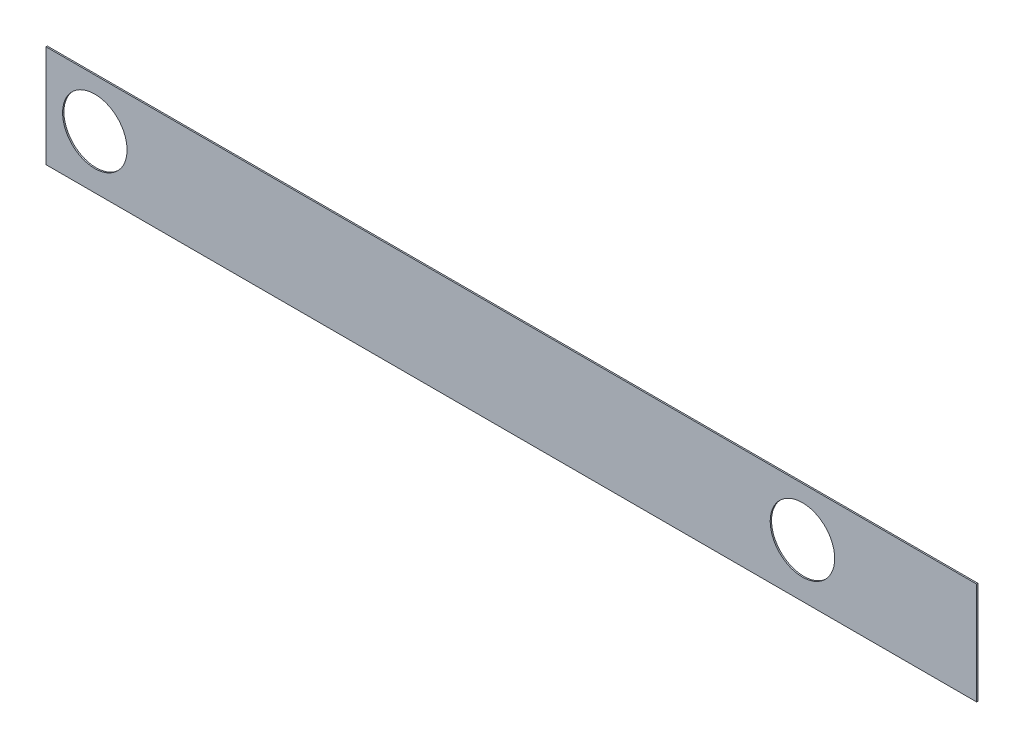
ISO-10303-21;
HEADER;
FILE_DESCRIPTION(('STEP AP214'),'2;1');
FILE_NAME('part.step','',(''),(''),'','','');
FILE_SCHEMA(('AUTOMOTIVE_DESIGN { 1 0 10303 214 1 1 1 1 }'));
ENDSEC;
DATA;
#1=APPLICATION_CONTEXT('core data for automotive mechanical design processes');
#2=APPLICATION_PROTOCOL_DEFINITION('international standard','automotive_design',2000,#1);
#3=PRODUCT_CONTEXT('',#1,'mechanical');
#4=PRODUCT('Part','Part','',(#3));
#5=PRODUCT_RELATED_PRODUCT_CATEGORY('part','',(#4));
#6=PRODUCT_DEFINITION_FORMATION('','',#4);
#7=PRODUCT_DEFINITION_CONTEXT('part definition',#1,'design');
#8=PRODUCT_DEFINITION('design','',#6,#7);
#9=PRODUCT_DEFINITION_SHAPE('','',#8);
#10=(LENGTH_UNIT() NAMED_UNIT(*) SI_UNIT(.MILLI.,.METRE.));
#11=(NAMED_UNIT(*) PLANE_ANGLE_UNIT() SI_UNIT($,.RADIAN.));
#12=(NAMED_UNIT(*) SI_UNIT($,.STERADIAN.) SOLID_ANGLE_UNIT());
#13=UNCERTAINTY_MEASURE_WITH_UNIT(LENGTH_MEASURE(1.E-05),#10,'distance_accuracy_value','');
#14=(GEOMETRIC_REPRESENTATION_CONTEXT(3) GLOBAL_UNCERTAINTY_ASSIGNED_CONTEXT((#13)) GLOBAL_UNIT_ASSIGNED_CONTEXT((#10,
#11,#12)) REPRESENTATION_CONTEXT('',''));
#15=CARTESIAN_POINT('',(0.,0.,0.));
#16=DIRECTION('',(0.,0.,1.));
#17=DIRECTION('',(1.,0.,0.));
#18=AXIS2_PLACEMENT_3D('',#15,#16,#17);
#19=CARTESIAN_POINT('',(-51.95,5.7,0.));
#20=DIRECTION('',(0.,-1.,0.));
#21=DIRECTION('',(0.,0.,-1.));
#22=AXIS2_PLACEMENT_3D('',#19,#20,#21);
#23=PLANE('',#22);
#24=DIRECTION('',(0.,0.,1.));
#25=VECTOR('',#24,1.);
#26=CARTESIAN_POINT('',(-51.95,5.7,0.));
#27=LINE('',#26,#25);
#28=CARTESIAN_POINT('',(-51.95,5.7,0.));
#29=VERTEX_POINT('',#28);
#30=CARTESIAN_POINT('',(-51.95,5.7,0.15));
#31=VERTEX_POINT('',#30);
#32=EDGE_CURVE('E11',#29,#31,#27,.T.);
#33=ORIENTED_EDGE('',*,*,#32,.T.);
#34=DIRECTION('',(1.,0.,0.));
#35=VECTOR('',#34,1.);
#36=CARTESIAN_POINT('',(-51.95,5.7,0.15));
#37=LINE('',#36,#35);
#38=CARTESIAN_POINT('',(51.95,5.7,0.15));
#39=VERTEX_POINT('',#38);
#40=EDGE_CURVE('E115',#31,#39,#37,.T.);
#41=ORIENTED_EDGE('',*,*,#40,.T.);
#42=DIRECTION('',(0.,0.,1.));
#43=VECTOR('',#42,1.);
#44=CARTESIAN_POINT('',(51.95,5.7,0.));
#45=LINE('',#44,#43);
#46=CARTESIAN_POINT('',(51.95,5.7,0.));
#47=VERTEX_POINT('',#46);
#48=EDGE_CURVE('E128',#47,#39,#45,.T.);
#49=ORIENTED_EDGE('',*,*,#48,.F.);
#50=DIRECTION('',(1.,0.,0.));
#51=VECTOR('',#50,1.);
#52=CARTESIAN_POINT('',(-51.95,5.7,0.));
#53=LINE('',#52,#51);
#54=EDGE_CURVE('E155',#29,#47,#53,.T.);
#55=ORIENTED_EDGE('',*,*,#54,.F.);
#56=EDGE_LOOP('',(#33,#41,#49,#55));
#57=FACE_BOUND('',#56,.T.);
#58=ADVANCED_FACE('F17',(#57),#23,.F.);
#59=CARTESIAN_POINT('',(-51.95,-5.7,0.));
#60=DIRECTION('',(1.,0.,0.));
#61=DIRECTION('',(0.,1.,0.));
#62=AXIS2_PLACEMENT_3D('',#59,#60,#61);
#63=PLANE('',#62);
#64=DIRECTION('',(0.,0.,1.));
#65=VECTOR('',#64,1.);
#66=CARTESIAN_POINT('',(-51.95,-5.7,0.));
#67=LINE('',#66,#65);
#68=CARTESIAN_POINT('',(-51.95,-5.7,0.));
#69=VERTEX_POINT('',#68);
#70=CARTESIAN_POINT('',(-51.95,-5.7,0.15));
#71=VERTEX_POINT('',#70);
#72=EDGE_CURVE('E27',#69,#71,#67,.T.);
#73=ORIENTED_EDGE('',*,*,#72,.T.);
#74=DIRECTION('',(0.,1.,0.));
#75=VECTOR('',#74,1.);
#76=CARTESIAN_POINT('',(-51.95,-5.7,0.15));
#77=LINE('',#76,#75);
#78=EDGE_CURVE('E98',#71,#31,#77,.T.);
#79=ORIENTED_EDGE('',*,*,#78,.T.);
#80=ORIENTED_EDGE('',*,*,#32,.F.);
#81=DIRECTION('',(0.,1.,0.));
#82=VECTOR('',#81,1.);
#83=CARTESIAN_POINT('',(-51.95,-5.7,0.));
#84=LINE('',#83,#82);
#85=EDGE_CURVE('E102',#69,#29,#84,.T.);
#86=ORIENTED_EDGE('',*,*,#85,.F.);
#87=EDGE_LOOP('',(#73,#79,#80,#86));
#88=FACE_BOUND('',#87,.T.);
#89=ADVANCED_FACE('F19',(#88),#63,.F.);
#90=CARTESIAN_POINT('',(51.95,-5.7,0.));
#91=DIRECTION('',(0.,1.,0.));
#92=DIRECTION('',(1.,0.,0.));
#93=AXIS2_PLACEMENT_3D('',#90,#91,#92);
#94=PLANE('',#93);
#95=DIRECTION('',(0.,0.,1.));
#96=VECTOR('',#95,1.);
#97=CARTESIAN_POINT('',(51.95,-5.7,0.));
#98=LINE('',#97,#96);
#99=CARTESIAN_POINT('',(51.95,-5.7,0.));
#100=VERTEX_POINT('',#99);
#101=CARTESIAN_POINT('',(51.95,-5.7,0.15));
#102=VERTEX_POINT('',#101);
#103=EDGE_CURVE('E87',#100,#102,#98,.T.);
#104=ORIENTED_EDGE('',*,*,#103,.T.);
#105=DIRECTION('',(-1.,0.,0.));
#106=VECTOR('',#105,1.);
#107=CARTESIAN_POINT('',(51.95,-5.7,0.15));
#108=LINE('',#107,#106);
#109=EDGE_CURVE('E106',#102,#71,#108,.T.);
#110=ORIENTED_EDGE('',*,*,#109,.T.);
#111=ORIENTED_EDGE('',*,*,#72,.F.);
#112=DIRECTION('',(-1.,0.,0.));
#113=VECTOR('',#112,1.);
#114=CARTESIAN_POINT('',(51.95,-5.7,0.));
#115=LINE('',#114,#113);
#116=EDGE_CURVE('E450',#100,#69,#115,.T.);
#117=ORIENTED_EDGE('',*,*,#116,.F.);
#118=EDGE_LOOP('',(#104,#110,#111,#117));
#119=FACE_BOUND('',#118,.T.);
#120=ADVANCED_FACE('F107',(#119),#94,.F.);
#121=CARTESIAN_POINT('',(51.95,5.7,0.));
#122=DIRECTION('',(-1.,0.,0.));
#123=DIRECTION('',(0.,0.,1.));
#124=AXIS2_PLACEMENT_3D('',#121,#122,#123);
#125=PLANE('',#124);
#126=ORIENTED_EDGE('',*,*,#48,.T.);
#127=DIRECTION('',(0.,-1.,0.));
#128=VECTOR('',#127,1.);
#129=CARTESIAN_POINT('',(51.95,5.7,0.15));
#130=LINE('',#129,#128);
#131=EDGE_CURVE('E111',#39,#102,#130,.T.);
#132=ORIENTED_EDGE('',*,*,#131,.T.);
#133=ORIENTED_EDGE('',*,*,#103,.F.);
#134=DIRECTION('',(0.,-1.,0.));
#135=VECTOR('',#134,1.);
#136=CARTESIAN_POINT('',(51.95,5.7,0.));
#137=LINE('',#136,#135);
#138=EDGE_CURVE('E151',#47,#100,#137,.T.);
#139=ORIENTED_EDGE('',*,*,#138,.F.);
#140=EDGE_LOOP('',(#126,#132,#133,#139));
#141=FACE_BOUND('',#140,.T.);
#142=ADVANCED_FACE('F149',(#141),#125,.F.);
#143=CARTESIAN_POINT('',(32.5,0.25,0.));
#144=DIRECTION('',(0.,0.,1.));
#145=DIRECTION('',(1.,0.,0.));
#146=AXIS2_PLACEMENT_3D('',#143,#144,#145);
#147=CYLINDRICAL_SURFACE('',#146,3.6);
#148=DIRECTION('',(0.,0.,1.));
#149=VECTOR('',#148,1.);
#150=CARTESIAN_POINT('',(28.9,0.25,0.));
#151=LINE('',#150,#149);
#152=CARTESIAN_POINT('',(28.9,0.25,0.));
#153=VERTEX_POINT('',#152);
#154=CARTESIAN_POINT('',(28.9,0.25,0.15));
#155=VERTEX_POINT('',#154);
#156=EDGE_CURVE('E138',#153,#155,#151,.T.);
#157=ORIENTED_EDGE('',*,*,#156,.T.);
#158=CARTESIAN_POINT('',(32.5,0.25,0.15));
#159=DIRECTION('',(0.,0.,1.));
#160=DIRECTION('',(-1.,0.,0.));
#161=AXIS2_PLACEMENT_3D('',#158,#159,#160);
#162=CIRCLE('',#161,3.6);
#163=CARTESIAN_POINT('',(36.1,0.25,0.15));
#164=VERTEX_POINT('',#163);
#165=EDGE_CURVE('E131',#155,#164,#162,.T.);
#166=ORIENTED_EDGE('',*,*,#165,.T.);
#167=DIRECTION('',(0.,0.,1.));
#168=VECTOR('',#167,1.);
#169=CARTESIAN_POINT('',(36.1,0.25,0.));
#170=LINE('',#169,#168);
#171=CARTESIAN_POINT('',(36.1,0.25,0.));
#172=VERTEX_POINT('',#171);
#173=EDGE_CURVE('E40',#172,#164,#170,.T.);
#174=ORIENTED_EDGE('',*,*,#173,.F.);
#175=CARTESIAN_POINT('',(32.5,0.25,0.));
#176=DIRECTION('',(0.,0.,1.));
#177=DIRECTION('',(-1.,0.,0.));
#178=AXIS2_PLACEMENT_3D('',#175,#176,#177);
#179=CIRCLE('',#178,3.6);
#180=EDGE_CURVE('E176',#153,#172,#179,.T.);
#181=ORIENTED_EDGE('',*,*,#180,.F.);
#182=EDGE_LOOP('',(#157,#166,#174,#181));
#183=FACE_BOUND('',#182,.T.);
#184=ADVANCED_FACE('F180',(#183),#147,.F.);
#185=CARTESIAN_POINT('',(32.5,0.25,0.));
#186=DIRECTION('',(0.,0.,1.));
#187=DIRECTION('',(1.,0.,0.));
#188=AXIS2_PLACEMENT_3D('',#185,#186,#187);
#189=CYLINDRICAL_SURFACE('',#188,3.6);
#190=ORIENTED_EDGE('',*,*,#173,.T.);
#191=CARTESIAN_POINT('',(32.5,0.25,0.15));
#192=DIRECTION('',(0.,0.,1.));
#193=DIRECTION('',(1.,0.,0.));
#194=AXIS2_PLACEMENT_3D('',#191,#192,#193);
#195=CIRCLE('',#194,3.6);
#196=EDGE_CURVE('E135',#164,#155,#195,.T.);
#197=ORIENTED_EDGE('',*,*,#196,.T.);
#198=ORIENTED_EDGE('',*,*,#156,.F.);
#199=CARTESIAN_POINT('',(32.5,0.25,0.));
#200=DIRECTION('',(0.,0.,1.));
#201=DIRECTION('',(1.,0.,0.));
#202=AXIS2_PLACEMENT_3D('',#199,#200,#201);
#203=CIRCLE('',#202,3.6);
#204=EDGE_CURVE('E168',#172,#153,#203,.T.);
#205=ORIENTED_EDGE('',*,*,#204,.F.);
#206=EDGE_LOOP('',(#190,#197,#198,#205));
#207=FACE_BOUND('',#206,.T.);
#208=ADVANCED_FACE('F167',(#207),#189,.F.);
#209=CARTESIAN_POINT('',(55.,10.,0.15));
#210=DIRECTION('',(0.,0.,-1.));
#211=DIRECTION('',(0.,-1.,0.));
#212=AXIS2_PLACEMENT_3D('',#209,#210,#211);
#213=PLANE('',#212);
#214=CARTESIAN_POINT('',(-46.5,0.25,0.15));
#215=DIRECTION('',(0.,0.,1.));
#216=DIRECTION('',(-1.,0.,0.));
#217=AXIS2_PLACEMENT_3D('',#214,#215,#216);
#218=CIRCLE('',#217,3.6);
#219=CARTESIAN_POINT('',(-50.1,0.25,0.15));
#220=VERTEX_POINT('',#219);
#221=CARTESIAN_POINT('',(-42.9,0.25,0.15));
#222=VERTEX_POINT('',#221);
#223=EDGE_CURVE('E124',#220,#222,#218,.T.);
#224=ORIENTED_EDGE('',*,*,#223,.F.);
#225=CARTESIAN_POINT('',(-46.5,0.25,0.15));
#226=DIRECTION('',(0.,0.,1.));
#227=DIRECTION('',(1.,0.,0.));
#228=AXIS2_PLACEMENT_3D('',#225,#226,#227);
#229=CIRCLE('',#228,3.6);
#230=EDGE_CURVE('E192',#222,#220,#229,.T.);
#231=ORIENTED_EDGE('',*,*,#230,.F.);
#232=EDGE_LOOP('',(#224,#231));
#233=FACE_BOUND('',#232,.T.);
#234=ORIENTED_EDGE('',*,*,#165,.F.);
#235=ORIENTED_EDGE('',*,*,#196,.F.);
#236=EDGE_LOOP('',(#234,#235));
#237=FACE_BOUND('',#236,.T.);
#238=ORIENTED_EDGE('',*,*,#40,.F.);
#239=ORIENTED_EDGE('',*,*,#78,.F.);
#240=ORIENTED_EDGE('',*,*,#109,.F.);
#241=ORIENTED_EDGE('',*,*,#131,.F.);
#242=EDGE_LOOP('',(#238,#239,#240,#241));
#243=FACE_BOUND('',#242,.T.);
#244=ADVANCED_FACE('F113',(#233,#237,#243),#213,.F.);
#245=CARTESIAN_POINT('',(-46.5,0.25,0.));
#246=DIRECTION('',(0.,0.,1.));
#247=DIRECTION('',(1.,0.,0.));
#248=AXIS2_PLACEMENT_3D('',#245,#246,#247);
#249=CYLINDRICAL_SURFACE('',#248,3.6);
#250=DIRECTION('',(0.,0.,1.));
#251=VECTOR('',#250,1.);
#252=CARTESIAN_POINT('',(-50.1,0.25,0.));
#253=LINE('',#252,#251);
#254=CARTESIAN_POINT('',(-50.1,0.25,0.));
#255=VERTEX_POINT('',#254);
#256=EDGE_CURVE('E200',#255,#220,#253,.T.);
#257=ORIENTED_EDGE('',*,*,#256,.T.);
#258=ORIENTED_EDGE('',*,*,#223,.T.);
#259=DIRECTION('',(0.,0.,1.));
#260=VECTOR('',#259,1.);
#261=CARTESIAN_POINT('',(-42.9,0.25,0.));
#262=LINE('',#261,#260);
#263=CARTESIAN_POINT('',(-42.9,0.25,0.));
#264=VERTEX_POINT('',#263);
#265=EDGE_CURVE('E188',#264,#222,#262,.T.);
#266=ORIENTED_EDGE('',*,*,#265,.F.);
#267=CARTESIAN_POINT('',(-46.5,0.25,0.));
#268=DIRECTION('',(0.,0.,1.));
#269=DIRECTION('',(-1.,0.,0.));
#270=AXIS2_PLACEMENT_3D('',#267,#268,#269);
#271=CIRCLE('',#270,3.6);
#272=EDGE_CURVE('E178',#255,#264,#271,.T.);
#273=ORIENTED_EDGE('',*,*,#272,.F.);
#274=EDGE_LOOP('',(#257,#258,#266,#273));
#275=FACE_BOUND('',#274,.T.);
#276=ADVANCED_FACE('F207',(#275),#249,.F.);
#277=CARTESIAN_POINT('',(-46.5,0.25,0.));
#278=DIRECTION('',(0.,0.,1.));
#279=DIRECTION('',(1.,0.,0.));
#280=AXIS2_PLACEMENT_3D('',#277,#278,#279);
#281=CYLINDRICAL_SURFACE('',#280,3.6);
#282=ORIENTED_EDGE('',*,*,#265,.T.);
#283=ORIENTED_EDGE('',*,*,#230,.T.);
#284=ORIENTED_EDGE('',*,*,#256,.F.);
#285=CARTESIAN_POINT('',(-46.5,0.25,0.));
#286=DIRECTION('',(0.,0.,1.));
#287=DIRECTION('',(1.,0.,0.));
#288=AXIS2_PLACEMENT_3D('',#285,#286,#287);
#289=CIRCLE('',#288,3.6);
#290=EDGE_CURVE('E193',#264,#255,#289,.T.);
#291=ORIENTED_EDGE('',*,*,#290,.F.);
#292=EDGE_LOOP('',(#282,#283,#284,#291));
#293=FACE_BOUND('',#292,.T.);
#294=ADVANCED_FACE('F216',(#293),#281,.F.);
#295=CARTESIAN_POINT('',(0.,0.,0.));
#296=DIRECTION('',(0.,0.,1.));
#297=DIRECTION('',(1.,0.,0.));
#298=AXIS2_PLACEMENT_3D('',#295,#296,#297);
#299=PLANE('',#298);
#300=ORIENTED_EDGE('',*,*,#272,.T.);
#301=ORIENTED_EDGE('',*,*,#290,.T.);
#302=EDGE_LOOP('',(#300,#301));
#303=FACE_BOUND('',#302,.T.);
#304=ORIENTED_EDGE('',*,*,#180,.T.);
#305=ORIENTED_EDGE('',*,*,#204,.T.);
#306=EDGE_LOOP('',(#304,#305));
#307=FACE_BOUND('',#306,.T.);
#308=ORIENTED_EDGE('',*,*,#116,.T.);
#309=ORIENTED_EDGE('',*,*,#85,.T.);
#310=ORIENTED_EDGE('',*,*,#54,.T.);
#311=ORIENTED_EDGE('',*,*,#138,.T.);
#312=EDGE_LOOP('',(#308,#309,#310,#311));
#313=FACE_BOUND('',#312,.T.);
#314=ADVANCED_FACE('F174',(#303,#307,#313),#299,.F.);
#315=CLOSED_SHELL('',(#58,#89,#120,#142,#184,#208,#244,#276,#294,#314));
#316=MANIFOLD_SOLID_BREP('B1',#315);
#317=ADVANCED_BREP_SHAPE_REPRESENTATION('',(#18,#316),#14);
#318=SHAPE_DEFINITION_REPRESENTATION(#9,#317);
ENDSEC;
END-ISO-10303-21;
